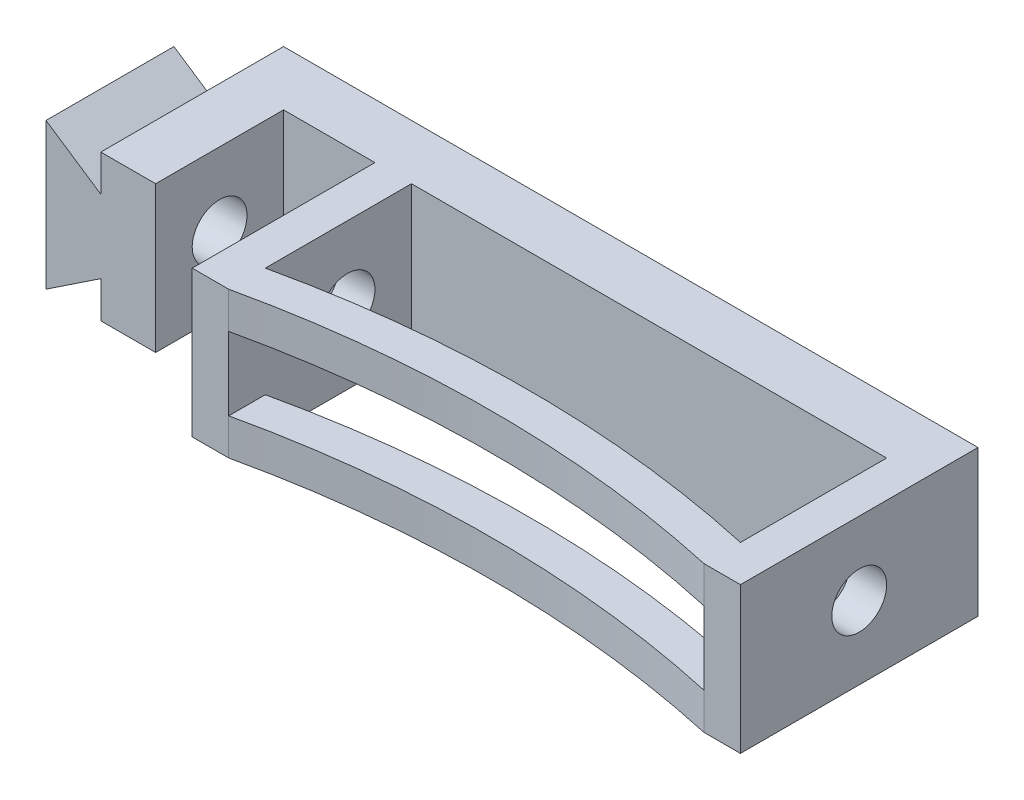
ISO-10303-21;
HEADER;
FILE_DESCRIPTION(('STEP AP214'),'2;1');
FILE_NAME('part.step','',(''),(''),'','','');
FILE_SCHEMA(('AUTOMOTIVE_DESIGN { 1 0 10303 214 1 1 1 1 }'));
ENDSEC;
DATA;
#1=APPLICATION_CONTEXT('core data for automotive mechanical design processes');
#2=APPLICATION_PROTOCOL_DEFINITION('international standard','automotive_design',2000,#1);
#3=PRODUCT_CONTEXT('',#1,'mechanical');
#4=PRODUCT('Part','Part','',(#3));
#5=PRODUCT_RELATED_PRODUCT_CATEGORY('part','',(#4));
#6=PRODUCT_DEFINITION_FORMATION('','',#4);
#7=PRODUCT_DEFINITION_CONTEXT('part definition',#1,'design');
#8=PRODUCT_DEFINITION('design','',#6,#7);
#9=PRODUCT_DEFINITION_SHAPE('','',#8);
#10=(LENGTH_UNIT() NAMED_UNIT(*) SI_UNIT(.MILLI.,.METRE.));
#11=(NAMED_UNIT(*) PLANE_ANGLE_UNIT() SI_UNIT($,.RADIAN.));
#12=(NAMED_UNIT(*) SI_UNIT($,.STERADIAN.) SOLID_ANGLE_UNIT());
#13=UNCERTAINTY_MEASURE_WITH_UNIT(LENGTH_MEASURE(1.E-05),#10,'distance_accuracy_value','');
#14=(GEOMETRIC_REPRESENTATION_CONTEXT(3) GLOBAL_UNCERTAINTY_ASSIGNED_CONTEXT((#13)) GLOBAL_UNIT_ASSIGNED_CONTEXT((#10,
#11,#12)) REPRESENTATION_CONTEXT('',''));
#15=CARTESIAN_POINT('',(0.,0.,0.));
#16=DIRECTION('',(0.,0.,1.));
#17=DIRECTION('',(1.,0.,0.));
#18=AXIS2_PLACEMENT_3D('',#15,#16,#17);
#19=CARTESIAN_POINT('',(23.,-2.,71.5747385824299));
#20=DIRECTION('',(0.,1.,0.));
#21=DIRECTION('',(0.,0.,1.));
#22=AXIS2_PLACEMENT_3D('',#19,#20,#21);
#23=CYLINDRICAL_SURFACE('',#22,60.);
#24=CARTESIAN_POINT('',(23.,0.,71.5747385824299));
#25=DIRECTION('',(0.,-1.,0.));
#26=DIRECTION('',(1.,0.,0.));
#27=AXIS2_PLACEMENT_3D('',#24,#25,#26);
#28=CIRCLE('',#27,60.);
#29=CARTESIAN_POINT('',(36.,0.,13.));
#30=VERTEX_POINT('',#29);
#31=CARTESIAN_POINT('',(10.,0.,13.));
#32=VERTEX_POINT('',#31);
#33=EDGE_CURVE('E209',#30,#32,#28,.F.);
#34=ORIENTED_EDGE('',*,*,#33,.T.);
#35=DIRECTION('',(0.,1.,0.));
#36=VECTOR('',#35,1.);
#37=CARTESIAN_POINT('',(10.,5.99999999999999,13.));
#38=LINE('',#37,#36);
#39=CARTESIAN_POINT('',(10.,-2.,13.));
#40=VERTEX_POINT('',#39);
#41=EDGE_CURVE('E217',#40,#32,#38,.T.);
#42=ORIENTED_EDGE('',*,*,#41,.F.);
#43=CARTESIAN_POINT('',(23.,-2.,71.5747385824299));
#44=DIRECTION('',(0.,-1.,0.));
#45=DIRECTION('',(0.,0.,-1.));
#46=AXIS2_PLACEMENT_3D('',#43,#44,#45);
#47=CIRCLE('',#46,60.);
#48=CARTESIAN_POINT('',(36.,-2.,13.));
#49=VERTEX_POINT('',#48);
#50=EDGE_CURVE('E368',#40,#49,#47,.T.);
#51=ORIENTED_EDGE('',*,*,#50,.T.);
#52=DIRECTION('',(0.,-1.,0.));
#53=VECTOR('',#52,1.);
#54=CARTESIAN_POINT('',(36.,5.99999999999999,13.));
#55=LINE('',#54,#53);
#56=EDGE_CURVE('E219',#30,#49,#55,.T.);
#57=ORIENTED_EDGE('',*,*,#56,.F.);
#58=EDGE_LOOP('',(#34,#42,#51,#57));
#59=FACE_BOUND('',#58,.T.);
#60=ADVANCED_FACE('F43',(#59),#23,.F.);
#61=CARTESIAN_POINT('',(23.,-2.,69.5747385824299));
#62=DIRECTION('',(0.,1.,0.));
#63=DIRECTION('',(0.,0.,1.));
#64=AXIS2_PLACEMENT_3D('',#61,#62,#63);
#65=CYLINDRICAL_SURFACE('',#64,60.);
#66=CARTESIAN_POINT('',(23.,0.,69.5747385824299));
#67=DIRECTION('',(0.,-1.,0.));
#68=DIRECTION('',(1.,0.,0.));
#69=AXIS2_PLACEMENT_3D('',#66,#67,#68);
#70=CIRCLE('',#69,60.);
#71=CARTESIAN_POINT('',(10.,0.,11.));
#72=VERTEX_POINT('',#71);
#73=CARTESIAN_POINT('',(36.,0.,11.));
#74=VERTEX_POINT('',#73);
#75=EDGE_CURVE('E212',#72,#74,#70,.T.);
#76=ORIENTED_EDGE('',*,*,#75,.T.);
#77=DIRECTION('',(0.,1.,0.));
#78=VECTOR('',#77,1.);
#79=CARTESIAN_POINT('',(36.,-2.,11.));
#80=LINE('',#79,#78);
#81=CARTESIAN_POINT('',(36.,-2.,11.));
#82=VERTEX_POINT('',#81);
#83=EDGE_CURVE('E416',#82,#74,#80,.T.);
#84=ORIENTED_EDGE('',*,*,#83,.F.);
#85=CARTESIAN_POINT('',(23.,-2.,69.5747385824299));
#86=DIRECTION('',(0.,1.,0.));
#87=DIRECTION('',(0.,0.,-1.));
#88=AXIS2_PLACEMENT_3D('',#85,#86,#87);
#89=CIRCLE('',#88,60.);
#90=CARTESIAN_POINT('',(10.,-2.,11.));
#91=VERTEX_POINT('',#90);
#92=EDGE_CURVE('E426',#82,#91,#89,.T.);
#93=ORIENTED_EDGE('',*,*,#92,.T.);
#94=DIRECTION('',(0.,1.,0.));
#95=VECTOR('',#94,1.);
#96=CARTESIAN_POINT('',(10.,-2.,11.));
#97=LINE('',#96,#95);
#98=EDGE_CURVE('E415',#91,#72,#97,.T.);
#99=ORIENTED_EDGE('',*,*,#98,.T.);
#100=EDGE_LOOP('',(#76,#84,#93,#99));
#101=FACE_BOUND('',#100,.T.);
#102=ADVANCED_FACE('F454',(#101),#65,.T.);
#103=CARTESIAN_POINT('',(0.,0.,3.));
#104=DIRECTION('',(0.,0.,1.));
#105=DIRECTION('',(1.,0.,0.));
#106=AXIS2_PLACEMENT_3D('',#103,#104,#105);
#107=PLANE('',#106);
#108=DIRECTION('',(-1.,0.,0.));
#109=VECTOR('',#108,1.);
#110=CARTESIAN_POINT('',(38.,-2.,3.));
#111=LINE('',#110,#109);
#112=CARTESIAN_POINT('',(36.,-2.,3.));
#113=VERTEX_POINT('',#112);
#114=CARTESIAN_POINT('',(10.,-2.,3.));
#115=VERTEX_POINT('',#114);
#116=EDGE_CURVE('E242',#113,#115,#111,.T.);
#117=ORIENTED_EDGE('',*,*,#116,.F.);
#118=DIRECTION('',(0.,-1.,0.));
#119=VECTOR('',#118,1.);
#120=CARTESIAN_POINT('',(36.,5.99999999999999,3.));
#121=LINE('',#120,#119);
#122=CARTESIAN_POINT('',(36.,5.99999999999999,3.));
#123=VERTEX_POINT('',#122);
#124=EDGE_CURVE('E340',#123,#113,#121,.T.);
#125=ORIENTED_EDGE('',*,*,#124,.F.);
#126=DIRECTION('',(1.,0.,0.));
#127=VECTOR('',#126,1.);
#128=CARTESIAN_POINT('',(38.,6.,3.));
#129=LINE('',#128,#127);
#130=CARTESIAN_POINT('',(10.,6.,3.));
#131=VERTEX_POINT('',#130);
#132=EDGE_CURVE('E254',#131,#123,#129,.T.);
#133=ORIENTED_EDGE('',*,*,#132,.F.);
#134=DIRECTION('',(0.,1.,0.));
#135=VECTOR('',#134,1.);
#136=CARTESIAN_POINT('',(10.,5.99999999999999,3.));
#137=LINE('',#136,#135);
#138=EDGE_CURVE('E236',#115,#131,#137,.T.);
#139=ORIENTED_EDGE('',*,*,#138,.F.);
#140=EDGE_LOOP('',(#117,#125,#133,#139));
#141=FACE_BOUND('',#140,.T.);
#142=ADVANCED_FACE('F461',(#141),#107,.T.);
#143=CARTESIAN_POINT('',(8.00000000000001,-2.,3.));
#144=VERTEX_POINT('',#143);
#145=CARTESIAN_POINT('',(3.,-2.,3.));
#146=VERTEX_POINT('',#145);
#147=EDGE_CURVE('E239',#144,#146,#111,.T.);
#148=ORIENTED_EDGE('',*,*,#147,.F.);
#149=DIRECTION('',(0.,-1.,0.));
#150=VECTOR('',#149,1.);
#151=CARTESIAN_POINT('',(8.,5.99999999999999,3.));
#152=LINE('',#151,#150);
#153=CARTESIAN_POINT('',(8.,5.99999999999999,3.));
#154=VERTEX_POINT('',#153);
#155=EDGE_CURVE('E342',#154,#144,#152,.T.);
#156=ORIENTED_EDGE('',*,*,#155,.F.);
#157=CARTESIAN_POINT('',(3.,5.99999999999999,3.));
#158=VERTEX_POINT('',#157);
#159=EDGE_CURVE('E250',#158,#154,#129,.T.);
#160=ORIENTED_EDGE('',*,*,#159,.F.);
#161=DIRECTION('',(0.,1.,0.));
#162=VECTOR('',#161,1.);
#163=CARTESIAN_POINT('',(3.,5.99999999999999,3.));
#164=LINE('',#163,#162);
#165=EDGE_CURVE('E237',#146,#158,#164,.T.);
#166=ORIENTED_EDGE('',*,*,#165,.F.);
#167=EDGE_LOOP('',(#148,#156,#160,#166));
#168=FACE_BOUND('',#167,.T.);
#169=ADVANCED_FACE('F366',(#168),#107,.T.);
#170=CARTESIAN_POINT('',(38.,0.,10.));
#171=DIRECTION('',(1.,0.,0.));
#172=DIRECTION('',(0.,0.,-1.));
#173=AXIS2_PLACEMENT_3D('',#170,#171,#172);
#174=PLANE('',#173);
#175=CARTESIAN_POINT('',(38.,1.99999999999999,6.5));
#176=DIRECTION('',(1.,0.,0.));
#177=DIRECTION('',(0.,1.,0.));
#178=AXIS2_PLACEMENT_3D('',#175,#176,#177);
#179=CIRCLE('',#178,1.5);
#180=CARTESIAN_POINT('',(38.,3.49999999999999,6.5));
#181=VERTEX_POINT('',#180);
#182=EDGE_CURVE('E409',#181,#181,#179,.T.);
#183=ORIENTED_EDGE('',*,*,#182,.F.);
#184=EDGE_LOOP('',(#183));
#185=FACE_BOUND('',#184,.T.);
#186=DIRECTION('',(0.,0.,-1.));
#187=VECTOR('',#186,1.);
#188=CARTESIAN_POINT('',(38.,6.,10.));
#189=LINE('',#188,#187);
#190=CARTESIAN_POINT('',(38.,6.,13.));
#191=VERTEX_POINT('',#190);
#192=CARTESIAN_POINT('',(38.,6.,0.));
#193=VERTEX_POINT('',#192);
#194=EDGE_CURVE('E304',#191,#193,#189,.T.);
#195=ORIENTED_EDGE('',*,*,#194,.F.);
#196=DIRECTION('',(0.,1.,0.));
#197=VECTOR('',#196,1.);
#198=CARTESIAN_POINT('',(38.,6.,13.));
#199=LINE('',#198,#197);
#200=CARTESIAN_POINT('',(38.,-2.,13.));
#201=VERTEX_POINT('',#200);
#202=EDGE_CURVE('E325',#201,#191,#199,.T.);
#203=ORIENTED_EDGE('',*,*,#202,.F.);
#204=DIRECTION('',(0.,0.,-1.));
#205=VECTOR('',#204,1.);
#206=CARTESIAN_POINT('',(38.,-2.,10.));
#207=LINE('',#206,#205);
#208=CARTESIAN_POINT('',(38.,-2.,0.));
#209=VERTEX_POINT('',#208);
#210=EDGE_CURVE('E306',#201,#209,#207,.T.);
#211=ORIENTED_EDGE('',*,*,#210,.T.);
#212=DIRECTION('',(0.,-1.,0.));
#213=VECTOR('',#212,1.);
#214=CARTESIAN_POINT('',(38.,0.,0.));
#215=LINE('',#214,#213);
#216=EDGE_CURVE('E289',#193,#209,#215,.T.);
#217=ORIENTED_EDGE('',*,*,#216,.F.);
#218=EDGE_LOOP('',(#195,#203,#211,#217));
#219=FACE_BOUND('',#218,.T.);
#220=ADVANCED_FACE('F321',(#185,#219),#174,.T.);
#221=CARTESIAN_POINT('',(0.,0.,10.));
#222=DIRECTION('',(-0.554700196225229,0.832050294337844,0.));
#223=DIRECTION('',(-0.832050294337844,-0.554700196225229,0.));
#224=AXIS2_PLACEMENT_3D('',#221,#222,#223);
#225=PLANE('',#224);
#226=DIRECTION('',(0.,0.,-1.));
#227=VECTOR('',#226,1.);
#228=CARTESIAN_POINT('',(-3.,-2.,10.));
#229=LINE('',#228,#227);
#230=CARTESIAN_POINT('',(-3.,-2.,10.));
#231=VERTEX_POINT('',#230);
#232=CARTESIAN_POINT('',(-3.,-2.,3.));
#233=VERTEX_POINT('',#232);
#234=EDGE_CURVE('E284',#231,#233,#229,.T.);
#235=ORIENTED_EDGE('',*,*,#234,.T.);
#236=DIRECTION('',(0.832050294337844,0.554700196225229,0.));
#237=VECTOR('',#236,1.);
#238=CARTESIAN_POINT('',(0.,0.,3.));
#239=LINE('',#238,#237);
#240=CARTESIAN_POINT('',(0.,0.,3.));
#241=VERTEX_POINT('',#240);
#242=EDGE_CURVE('E257',#233,#241,#239,.T.);
#243=ORIENTED_EDGE('',*,*,#242,.T.);
#244=DIRECTION('',(0.,0.,-1.));
#245=VECTOR('',#244,1.);
#246=CARTESIAN_POINT('',(0.,0.,10.));
#247=LINE('',#246,#245);
#248=CARTESIAN_POINT('',(0.,0.,10.));
#249=VERTEX_POINT('',#248);
#250=EDGE_CURVE('E12',#249,#241,#247,.T.);
#251=ORIENTED_EDGE('',*,*,#250,.F.);
#252=DIRECTION('',(0.832050294337844,0.554700196225229,0.));
#253=VECTOR('',#252,1.);
#254=CARTESIAN_POINT('',(0.,0.,10.));
#255=LINE('',#254,#253);
#256=EDGE_CURVE('E266',#231,#249,#255,.T.);
#257=ORIENTED_EDGE('',*,*,#256,.F.);
#258=EDGE_LOOP('',(#235,#243,#251,#257));
#259=FACE_BOUND('',#258,.T.);
#260=ADVANCED_FACE('F45',(#259),#225,.F.);
#261=CARTESIAN_POINT('',(0.,-2.,10.));
#262=DIRECTION('',(0.,1.,0.));
#263=DIRECTION('',(0.,0.,1.));
#264=AXIS2_PLACEMENT_3D('',#261,#262,#263);
#265=PLANE('',#264);
#266=DIRECTION('',(0.,0.,-1.));
#267=VECTOR('',#266,1.);
#268=CARTESIAN_POINT('',(10.,-2.,13.));
#269=LINE('',#268,#267);
#270=EDGE_CURVE('E347',#91,#115,#269,.T.);
#271=ORIENTED_EDGE('',*,*,#270,.F.);
#272=ORIENTED_EDGE('',*,*,#92,.F.);
#273=DIRECTION('',(0.,0.,-1.));
#274=VECTOR('',#273,1.);
#275=CARTESIAN_POINT('',(36.,-2.,13.));
#276=LINE('',#275,#274);
#277=EDGE_CURVE('E332',#82,#113,#276,.T.);
#278=ORIENTED_EDGE('',*,*,#277,.T.);
#279=ORIENTED_EDGE('',*,*,#116,.T.);
#280=EDGE_LOOP('',(#271,#272,#278,#279));
#281=FACE_BOUND('',#280,.T.);
#282=ORIENTED_EDGE('',*,*,#210,.F.);
#283=DIRECTION('',(1.,0.,0.));
#284=VECTOR('',#283,1.);
#285=CARTESIAN_POINT('',(38.,-2.,13.));
#286=LINE('',#285,#284);
#287=EDGE_CURVE('E328',#49,#201,#286,.T.);
#288=ORIENTED_EDGE('',*,*,#287,.F.);
#289=ORIENTED_EDGE('',*,*,#50,.F.);
#290=DIRECTION('',(1.,0.,0.));
#291=VECTOR('',#290,1.);
#292=CARTESIAN_POINT('',(8.00000000000001,-2.,13.));
#293=LINE('',#292,#291);
#294=CARTESIAN_POINT('',(8.00000000000001,-2.,13.));
#295=VERTEX_POINT('',#294);
#296=EDGE_CURVE('E226',#295,#40,#293,.T.);
#297=ORIENTED_EDGE('',*,*,#296,.F.);
#298=DIRECTION('',(0.,0.,-1.));
#299=VECTOR('',#298,1.);
#300=CARTESIAN_POINT('',(8.00000000000001,-2.,13.));
#301=LINE('',#300,#299);
#302=EDGE_CURVE('E345',#295,#144,#301,.T.);
#303=ORIENTED_EDGE('',*,*,#302,.T.);
#304=ORIENTED_EDGE('',*,*,#147,.T.);
#305=DIRECTION('',(0.,0.,1.));
#306=VECTOR('',#305,1.);
#307=CARTESIAN_POINT('',(3.,-2.,-35.9026461420325));
#308=LINE('',#307,#306);
#309=CARTESIAN_POINT('',(3.,-2.,10.));
#310=VERTEX_POINT('',#309);
#311=EDGE_CURVE('E240',#146,#310,#308,.T.);
#312=ORIENTED_EDGE('',*,*,#311,.T.);
#313=DIRECTION('',(1.,0.,0.));
#314=VECTOR('',#313,1.);
#315=CARTESIAN_POINT('',(0.,-2.,10.));
#316=LINE('',#315,#314);
#317=CARTESIAN_POINT('',(0.,-2.,10.));
#318=VERTEX_POINT('',#317);
#319=EDGE_CURVE('E272',#318,#310,#316,.T.);
#320=ORIENTED_EDGE('',*,*,#319,.F.);
#321=DIRECTION('',(0.,0.,-1.));
#322=VECTOR('',#321,1.);
#323=CARTESIAN_POINT('',(0.,-2.,10.));
#324=LINE('',#323,#322);
#325=CARTESIAN_POINT('',(0.,-2.,0.));
#326=VERTEX_POINT('',#325);
#327=EDGE_CURVE('E52',#318,#326,#324,.T.);
#328=ORIENTED_EDGE('',*,*,#327,.T.);
#329=DIRECTION('',(1.,0.,0.));
#330=VECTOR('',#329,1.);
#331=CARTESIAN_POINT('',(0.,-2.,0.));
#332=LINE('',#331,#330);
#333=EDGE_CURVE('E265',#326,#209,#332,.T.);
#334=ORIENTED_EDGE('',*,*,#333,.T.);
#335=EDGE_LOOP('',(#282,#288,#289,#297,#303,#304,#312,#320,#328,#334));
#336=FACE_BOUND('',#335,.T.);
#337=ADVANCED_FACE('F313',(#281,#336),#265,.F.);
#338=CARTESIAN_POINT('',(0.,6.,10.));
#339=DIRECTION('',(0.,1.,0.));
#340=DIRECTION('',(0.,0.,1.));
#341=AXIS2_PLACEMENT_3D('',#338,#339,#340);
#342=PLANE('',#341);
#343=CARTESIAN_POINT('',(23.,6.,69.5747385824299));
#344=DIRECTION('',(0.,1.,0.));
#345=DIRECTION('',(0.,0.,-1.));
#346=AXIS2_PLACEMENT_3D('',#343,#344,#345);
#347=CIRCLE('',#346,60.);
#348=CARTESIAN_POINT('',(36.,6.,11.));
#349=VERTEX_POINT('',#348);
#350=CARTESIAN_POINT('',(10.,6.,11.));
#351=VERTEX_POINT('',#350);
#352=EDGE_CURVE('E422',#349,#351,#347,.T.);
#353=ORIENTED_EDGE('',*,*,#352,.T.);
#354=DIRECTION('',(0.,0.,-1.));
#355=VECTOR('',#354,1.);
#356=CARTESIAN_POINT('',(10.,5.99999999999999,13.));
#357=LINE('',#356,#355);
#358=EDGE_CURVE('E350',#351,#131,#357,.T.);
#359=ORIENTED_EDGE('',*,*,#358,.T.);
#360=ORIENTED_EDGE('',*,*,#132,.T.);
#361=DIRECTION('',(0.,0.,-1.));
#362=VECTOR('',#361,1.);
#363=CARTESIAN_POINT('',(36.,5.99999999999999,13.));
#364=LINE('',#363,#362);
#365=EDGE_CURVE('E246',#349,#123,#364,.T.);
#366=ORIENTED_EDGE('',*,*,#365,.F.);
#367=EDGE_LOOP('',(#353,#359,#360,#366));
#368=FACE_BOUND('',#367,.T.);
#369=DIRECTION('',(0.,0.,1.));
#370=VECTOR('',#369,1.);
#371=CARTESIAN_POINT('',(3.,5.99999999999999,-35.9026461420325));
#372=LINE('',#371,#370);
#373=CARTESIAN_POINT('',(3.,6.,10.));
#374=VERTEX_POINT('',#373);
#375=EDGE_CURVE('E245',#158,#374,#372,.T.);
#376=ORIENTED_EDGE('',*,*,#375,.F.);
#377=ORIENTED_EDGE('',*,*,#159,.T.);
#378=DIRECTION('',(0.,0.,-1.));
#379=VECTOR('',#378,1.);
#380=CARTESIAN_POINT('',(8.,5.99999999999999,13.));
#381=LINE('',#380,#379);
#382=CARTESIAN_POINT('',(8.,5.99999999999999,13.));
#383=VERTEX_POINT('',#382);
#384=EDGE_CURVE('E352',#383,#154,#381,.T.);
#385=ORIENTED_EDGE('',*,*,#384,.F.);
#386=DIRECTION('',(-1.,0.,0.));
#387=VECTOR('',#386,1.);
#388=CARTESIAN_POINT('',(8.,5.99999999999999,13.));
#389=LINE('',#388,#387);
#390=CARTESIAN_POINT('',(10.,5.99999999999999,13.));
#391=VERTEX_POINT('',#390);
#392=EDGE_CURVE('E231',#391,#383,#389,.T.);
#393=ORIENTED_EDGE('',*,*,#392,.F.);
#394=CARTESIAN_POINT('',(23.,6.,71.5747385824299));
#395=DIRECTION('',(0.,-1.,0.));
#396=DIRECTION('',(0.,0.,-1.));
#397=AXIS2_PLACEMENT_3D('',#394,#395,#396);
#398=CIRCLE('',#397,60.);
#399=CARTESIAN_POINT('',(36.,6.,13.));
#400=VERTEX_POINT('',#399);
#401=EDGE_CURVE('E398',#391,#400,#398,.T.);
#402=ORIENTED_EDGE('',*,*,#401,.T.);
#403=DIRECTION('',(-1.,0.,0.));
#404=VECTOR('',#403,1.);
#405=CARTESIAN_POINT('',(38.,6.,13.));
#406=LINE('',#405,#404);
#407=EDGE_CURVE('E397',#191,#400,#406,.T.);
#408=ORIENTED_EDGE('',*,*,#407,.F.);
#409=ORIENTED_EDGE('',*,*,#194,.T.);
#410=DIRECTION('',(1.,0.,0.));
#411=VECTOR('',#410,1.);
#412=CARTESIAN_POINT('',(0.,6.,0.));
#413=LINE('',#412,#411);
#414=CARTESIAN_POINT('',(0.,6.,0.));
#415=VERTEX_POINT('',#414);
#416=EDGE_CURVE('E286',#415,#193,#413,.T.);
#417=ORIENTED_EDGE('',*,*,#416,.F.);
#418=DIRECTION('',(0.,0.,-1.));
#419=VECTOR('',#418,1.);
#420=CARTESIAN_POINT('',(0.,6.,10.));
#421=LINE('',#420,#419);
#422=CARTESIAN_POINT('',(0.,6.,10.));
#423=VERTEX_POINT('',#422);
#424=EDGE_CURVE('E302',#423,#415,#421,.T.);
#425=ORIENTED_EDGE('',*,*,#424,.F.);
#426=DIRECTION('',(1.,0.,0.));
#427=VECTOR('',#426,1.);
#428=CARTESIAN_POINT('',(0.,6.,10.));
#429=LINE('',#428,#427);
#430=EDGE_CURVE('E276',#423,#374,#429,.T.);
#431=ORIENTED_EDGE('',*,*,#430,.T.);
#432=EDGE_LOOP('',(#376,#377,#385,#393,#402,#408,#409,#417,#425,#431));
#433=FACE_BOUND('',#432,.T.);
#434=ADVANCED_FACE('F374',(#368,#433),#342,.T.);
#435=CARTESIAN_POINT('',(0.,0.,10.));
#436=DIRECTION('',(1.,0.,0.));
#437=DIRECTION('',(0.,0.,-1.));
#438=AXIS2_PLACEMENT_3D('',#435,#436,#437);
#439=PLANE('',#438);
#440=DIRECTION('',(0.,-1.,0.));
#441=VECTOR('',#440,1.);
#442=CARTESIAN_POINT('',(0.,0.,0.));
#443=LINE('',#442,#441);
#444=EDGE_CURVE('E270',#415,#326,#443,.T.);
#445=ORIENTED_EDGE('',*,*,#444,.T.);
#446=ORIENTED_EDGE('',*,*,#327,.F.);
#447=DIRECTION('',(0.,-1.,0.));
#448=VECTOR('',#447,1.);
#449=CARTESIAN_POINT('',(0.,0.,10.));
#450=LINE('',#449,#448);
#451=EDGE_CURVE('E269',#249,#318,#450,.T.);
#452=ORIENTED_EDGE('',*,*,#451,.F.);
#453=ORIENTED_EDGE('',*,*,#250,.T.);
#454=DIRECTION('',(0.,-1.,0.));
#455=VECTOR('',#454,1.);
#456=CARTESIAN_POINT('',(0.,0.,3.));
#457=LINE('',#456,#455);
#458=CARTESIAN_POINT('',(0.,4.,3.));
#459=VERTEX_POINT('',#458);
#460=EDGE_CURVE('E260',#459,#241,#457,.T.);
#461=ORIENTED_EDGE('',*,*,#460,.F.);
#462=DIRECTION('',(0.,0.,-1.));
#463=VECTOR('',#462,1.);
#464=CARTESIAN_POINT('',(0.,4.,10.));
#465=LINE('',#464,#463);
#466=CARTESIAN_POINT('',(0.,4.,10.));
#467=VERTEX_POINT('',#466);
#468=EDGE_CURVE('E299',#467,#459,#465,.T.);
#469=ORIENTED_EDGE('',*,*,#468,.F.);
#470=EDGE_CURVE('E273',#423,#467,#450,.T.);
#471=ORIENTED_EDGE('',*,*,#470,.F.);
#472=ORIENTED_EDGE('',*,*,#424,.T.);
#473=EDGE_LOOP('',(#445,#446,#452,#453,#461,#469,#471,#472));
#474=FACE_BOUND('',#473,.T.);
#475=ADVANCED_FACE('F383',(#474),#439,.F.);
#476=CARTESIAN_POINT('',(1.84615384615385,2.76923076923077,10.));
#477=DIRECTION('',(0.554700196225229,0.832050294337844,0.));
#478=DIRECTION('',(-0.832050294337844,0.554700196225229,0.));
#479=AXIS2_PLACEMENT_3D('',#476,#477,#478);
#480=PLANE('',#479);
#481=DIRECTION('',(0.832050294337844,-0.554700196225229,0.));
#482=VECTOR('',#481,1.);
#483=CARTESIAN_POINT('',(1.84615384615385,2.76923076923077,3.));
#484=LINE('',#483,#482);
#485=CARTESIAN_POINT('',(-3.,6.,3.));
#486=VERTEX_POINT('',#485);
#487=EDGE_CURVE('E262',#486,#459,#484,.T.);
#488=ORIENTED_EDGE('',*,*,#487,.F.);
#489=DIRECTION('',(0.,0.,-1.));
#490=VECTOR('',#489,1.);
#491=CARTESIAN_POINT('',(-3.,6.,10.));
#492=LINE('',#491,#490);
#493=CARTESIAN_POINT('',(-3.,6.,10.));
#494=VERTEX_POINT('',#493);
#495=EDGE_CURVE('E296',#494,#486,#492,.T.);
#496=ORIENTED_EDGE('',*,*,#495,.F.);
#497=DIRECTION('',(0.832050294337844,-0.554700196225229,0.));
#498=VECTOR('',#497,1.);
#499=CARTESIAN_POINT('',(1.84615384615385,2.76923076923077,10.));
#500=LINE('',#499,#498);
#501=EDGE_CURVE('E279',#494,#467,#500,.T.);
#502=ORIENTED_EDGE('',*,*,#501,.T.);
#503=ORIENTED_EDGE('',*,*,#468,.T.);
#504=EDGE_LOOP('',(#488,#496,#502,#503));
#505=FACE_BOUND('',#504,.T.);
#506=ADVANCED_FACE('F395',(#505),#480,.T.);
#507=CARTESIAN_POINT('',(-3.,0.,10.));
#508=DIRECTION('',(1.,0.,0.));
#509=DIRECTION('',(0.,1.,0.));
#510=AXIS2_PLACEMENT_3D('',#507,#508,#509);
#511=PLANE('',#510);
#512=ORIENTED_EDGE('',*,*,#495,.T.);
#513=DIRECTION('',(0.,-1.,0.));
#514=VECTOR('',#513,1.);
#515=CARTESIAN_POINT('',(-3.,0.,3.));
#516=LINE('',#515,#514);
#517=EDGE_CURVE('E253',#486,#233,#516,.T.);
#518=ORIENTED_EDGE('',*,*,#517,.T.);
#519=ORIENTED_EDGE('',*,*,#234,.F.);
#520=DIRECTION('',(0.,-1.,0.));
#521=VECTOR('',#520,1.);
#522=CARTESIAN_POINT('',(-3.,0.,10.));
#523=LINE('',#522,#521);
#524=EDGE_CURVE('E282',#494,#231,#523,.T.);
#525=ORIENTED_EDGE('',*,*,#524,.F.);
#526=EDGE_LOOP('',(#512,#518,#519,#525));
#527=FACE_BOUND('',#526,.T.);
#528=ADVANCED_FACE('F391',(#527),#511,.F.);
#529=CARTESIAN_POINT('',(0.,0.,10.));
#530=DIRECTION('',(0.,0.,1.));
#531=DIRECTION('',(1.,0.,0.));
#532=AXIS2_PLACEMENT_3D('',#529,#530,#531);
#533=PLANE('',#532);
#534=DIRECTION('',(0.,-1.,0.));
#535=VECTOR('',#534,1.);
#536=CARTESIAN_POINT('',(3.,5.99999999999999,10.));
#537=LINE('',#536,#535);
#538=EDGE_CURVE('E243',#374,#310,#537,.T.);
#539=ORIENTED_EDGE('',*,*,#538,.F.);
#540=ORIENTED_EDGE('',*,*,#430,.F.);
#541=ORIENTED_EDGE('',*,*,#470,.T.);
#542=ORIENTED_EDGE('',*,*,#501,.F.);
#543=ORIENTED_EDGE('',*,*,#524,.T.);
#544=ORIENTED_EDGE('',*,*,#256,.T.);
#545=ORIENTED_EDGE('',*,*,#451,.T.);
#546=ORIENTED_EDGE('',*,*,#319,.T.);
#547=EDGE_LOOP('',(#539,#540,#541,#542,#543,#544,#545,#546));
#548=FACE_BOUND('',#547,.T.);
#549=ADVANCED_FACE('F380',(#548),#533,.T.);
#550=CARTESIAN_POINT('',(0.,0.,0.));
#551=DIRECTION('',(0.,0.,1.));
#552=DIRECTION('',(1.,0.,0.));
#553=AXIS2_PLACEMENT_3D('',#550,#551,#552);
#554=PLANE('',#553);
#555=ORIENTED_EDGE('',*,*,#333,.F.);
#556=ORIENTED_EDGE('',*,*,#444,.F.);
#557=ORIENTED_EDGE('',*,*,#416,.T.);
#558=ORIENTED_EDGE('',*,*,#216,.T.);
#559=EDGE_LOOP('',(#555,#556,#557,#558));
#560=FACE_BOUND('',#559,.T.);
#561=ADVANCED_FACE('F317',(#560),#554,.F.);
#562=CARTESIAN_POINT('',(0.,0.,3.));
#563=DIRECTION('',(0.,0.,1.));
#564=DIRECTION('',(1.,0.,0.));
#565=AXIS2_PLACEMENT_3D('',#562,#563,#564);
#566=PLANE('',#565);
#567=ORIENTED_EDGE('',*,*,#517,.F.);
#568=ORIENTED_EDGE('',*,*,#487,.T.);
#569=ORIENTED_EDGE('',*,*,#460,.T.);
#570=ORIENTED_EDGE('',*,*,#242,.F.);
#571=EDGE_LOOP('',(#567,#568,#569,#570));
#572=FACE_BOUND('',#571,.T.);
#573=ADVANCED_FACE('F388',(#572),#566,.F.);
#574=CARTESIAN_POINT('',(3.,5.99999999999999,-35.9026461420325));
#575=DIRECTION('',(-1.,0.,0.));
#576=DIRECTION('',(0.,-1.,0.));
#577=AXIS2_PLACEMENT_3D('',#574,#575,#576);
#578=PLANE('',#577);
#579=CARTESIAN_POINT('',(3.,2.,6.5));
#580=DIRECTION('',(-1.,0.,0.));
#581=DIRECTION('',(0.,-1.,0.));
#582=AXIS2_PLACEMENT_3D('',#579,#580,#581);
#583=CIRCLE('',#582,1.5);
#584=CARTESIAN_POINT('',(3.,0.499999999999998,6.5));
#585=VERTEX_POINT('',#584);
#586=EDGE_CURVE('E348',#585,#585,#583,.F.);
#587=ORIENTED_EDGE('',*,*,#586,.F.);
#588=EDGE_LOOP('',(#587));
#589=FACE_BOUND('',#588,.T.);
#590=ORIENTED_EDGE('',*,*,#165,.T.);
#591=ORIENTED_EDGE('',*,*,#375,.T.);
#592=ORIENTED_EDGE('',*,*,#538,.T.);
#593=ORIENTED_EDGE('',*,*,#311,.F.);
#594=EDGE_LOOP('',(#590,#591,#592,#593));
#595=FACE_BOUND('',#594,.T.);
#596=ADVANCED_FACE('F378',(#589,#595),#578,.F.);
#597=CARTESIAN_POINT('',(8.,5.99999999999999,13.));
#598=DIRECTION('',(1.,0.,0.));
#599=DIRECTION('',(0.,1.,0.));
#600=AXIS2_PLACEMENT_3D('',#597,#598,#599);
#601=PLANE('',#600);
#602=CARTESIAN_POINT('',(8.,2.,6.5));
#603=DIRECTION('',(1.,0.,0.));
#604=DIRECTION('',(0.,1.,0.));
#605=AXIS2_PLACEMENT_3D('',#602,#603,#604);
#606=CIRCLE('',#605,1.5);
#607=CARTESIAN_POINT('',(8.,3.5,6.5));
#608=VERTEX_POINT('',#607);
#609=EDGE_CURVE('E403',#608,#608,#606,.F.);
#610=ORIENTED_EDGE('',*,*,#609,.F.);
#611=EDGE_LOOP('',(#610));
#612=FACE_BOUND('',#611,.T.);
#613=ORIENTED_EDGE('',*,*,#155,.T.);
#614=ORIENTED_EDGE('',*,*,#302,.F.);
#615=DIRECTION('',(0.,-1.,0.));
#616=VECTOR('',#615,1.);
#617=CARTESIAN_POINT('',(8.,5.99999999999999,13.));
#618=LINE('',#617,#616);
#619=EDGE_CURVE('E229',#383,#295,#618,.T.);
#620=ORIENTED_EDGE('',*,*,#619,.F.);
#621=ORIENTED_EDGE('',*,*,#384,.T.);
#622=EDGE_LOOP('',(#613,#614,#620,#621));
#623=FACE_BOUND('',#622,.T.);
#624=ADVANCED_FACE('F360',(#612,#623),#601,.F.);
#625=CARTESIAN_POINT('',(10.,5.99999999999999,13.));
#626=DIRECTION('',(-1.,0.,0.));
#627=DIRECTION('',(0.,-1.,0.));
#628=AXIS2_PLACEMENT_3D('',#625,#626,#627);
#629=PLANE('',#628);
#630=CARTESIAN_POINT('',(10.,2.,6.5));
#631=DIRECTION('',(-1.,0.,0.));
#632=DIRECTION('',(0.,-1.,0.));
#633=AXIS2_PLACEMENT_3D('',#630,#631,#632);
#634=CIRCLE('',#633,1.5);
#635=CARTESIAN_POINT('',(10.,0.499999999999996,6.5));
#636=VERTEX_POINT('',#635);
#637=EDGE_CURVE('E406',#636,#636,#634,.F.);
#638=ORIENTED_EDGE('',*,*,#637,.F.);
#639=EDGE_LOOP('',(#638));
#640=FACE_BOUND('',#639,.T.);
#641=ORIENTED_EDGE('',*,*,#358,.F.);
#642=CARTESIAN_POINT('',(10.,3.99999999999999,11.));
#643=VERTEX_POINT('',#642);
#644=EDGE_CURVE('E419',#643,#351,#97,.T.);
#645=ORIENTED_EDGE('',*,*,#644,.F.);
#646=DIRECTION('',(0.,0.,1.));
#647=VECTOR('',#646,1.);
#648=CARTESIAN_POINT('',(10.,4.,-0.000999999999999265));
#649=LINE('',#648,#647);
#650=CARTESIAN_POINT('',(10.,4.,13.));
#651=VERTEX_POINT('',#650);
#652=EDGE_CURVE('E64',#643,#651,#649,.T.);
#653=ORIENTED_EDGE('',*,*,#652,.T.);
#654=DIRECTION('',(0.,-1.,0.));
#655=VECTOR('',#654,1.);
#656=CARTESIAN_POINT('',(10.,4.,13.));
#657=LINE('',#656,#655);
#658=EDGE_CURVE('E192',#651,#32,#657,.T.);
#659=ORIENTED_EDGE('',*,*,#658,.T.);
#660=DIRECTION('',(0.,0.,1.));
#661=VECTOR('',#660,1.);
#662=CARTESIAN_POINT('',(10.,0.,-0.000999999999999265));
#663=LINE('',#662,#661);
#664=EDGE_CURVE('E197',#72,#32,#663,.T.);
#665=ORIENTED_EDGE('',*,*,#664,.F.);
#666=ORIENTED_EDGE('',*,*,#98,.F.);
#667=ORIENTED_EDGE('',*,*,#270,.T.);
#668=ORIENTED_EDGE('',*,*,#138,.T.);
#669=EDGE_LOOP('',(#641,#645,#653,#659,#665,#666,#667,#668));
#670=FACE_BOUND('',#669,.T.);
#671=ADVANCED_FACE('F195',(#640,#670),#629,.F.);
#672=CARTESIAN_POINT('',(0.,0.,13.));
#673=DIRECTION('',(0.,0.,1.));
#674=DIRECTION('',(1.,0.,0.));
#675=AXIS2_PLACEMENT_3D('',#672,#673,#674);
#676=PLANE('',#675);
#677=ORIENTED_EDGE('',*,*,#619,.T.);
#678=ORIENTED_EDGE('',*,*,#296,.T.);
#679=ORIENTED_EDGE('',*,*,#41,.T.);
#680=ORIENTED_EDGE('',*,*,#658,.F.);
#681=EDGE_CURVE('E227',#651,#391,#38,.T.);
#682=ORIENTED_EDGE('',*,*,#681,.T.);
#683=ORIENTED_EDGE('',*,*,#392,.T.);
#684=EDGE_LOOP('',(#677,#678,#679,#680,#682,#683));
#685=FACE_BOUND('',#684,.T.);
#686=ADVANCED_FACE('F225',(#685),#676,.T.);
#687=CARTESIAN_POINT('',(36.,5.99999999999999,13.));
#688=DIRECTION('',(1.,0.,0.));
#689=DIRECTION('',(0.,0.,-1.));
#690=AXIS2_PLACEMENT_3D('',#687,#688,#689);
#691=PLANE('',#690);
#692=CARTESIAN_POINT('',(36.,1.99999999999999,6.5));
#693=DIRECTION('',(1.,0.,0.));
#694=DIRECTION('',(0.,0.,-1.));
#695=AXIS2_PLACEMENT_3D('',#692,#693,#694);
#696=CIRCLE('',#695,1.5);
#697=CARTESIAN_POINT('',(36.,1.99999999999999,5.));
#698=VERTEX_POINT('',#697);
#699=EDGE_CURVE('E47',#698,#698,#696,.F.);
#700=ORIENTED_EDGE('',*,*,#699,.F.);
#701=EDGE_LOOP('',(#700));
#702=FACE_BOUND('',#701,.T.);
#703=ORIENTED_EDGE('',*,*,#277,.F.);
#704=ORIENTED_EDGE('',*,*,#83,.T.);
#705=DIRECTION('',(0.,0.,1.));
#706=VECTOR('',#705,1.);
#707=CARTESIAN_POINT('',(36.,0.,-0.000999999999999265));
#708=LINE('',#707,#706);
#709=EDGE_CURVE('E221',#74,#30,#708,.T.);
#710=ORIENTED_EDGE('',*,*,#709,.T.);
#711=DIRECTION('',(0.,1.,0.));
#712=VECTOR('',#711,1.);
#713=CARTESIAN_POINT('',(36.,4.,13.));
#714=LINE('',#713,#712);
#715=CARTESIAN_POINT('',(36.,3.99999999999999,13.));
#716=VERTEX_POINT('',#715);
#717=EDGE_CURVE('E203',#30,#716,#714,.T.);
#718=ORIENTED_EDGE('',*,*,#717,.T.);
#719=DIRECTION('',(0.,0.,1.));
#720=VECTOR('',#719,1.);
#721=CARTESIAN_POINT('',(36.,4.,-0.000999999999999265));
#722=LINE('',#721,#720);
#723=CARTESIAN_POINT('',(36.,4.,11.));
#724=VERTEX_POINT('',#723);
#725=EDGE_CURVE('E59',#724,#716,#722,.T.);
#726=ORIENTED_EDGE('',*,*,#725,.F.);
#727=EDGE_CURVE('E420',#724,#349,#80,.T.);
#728=ORIENTED_EDGE('',*,*,#727,.T.);
#729=ORIENTED_EDGE('',*,*,#365,.T.);
#730=ORIENTED_EDGE('',*,*,#124,.T.);
#731=EDGE_LOOP('',(#703,#704,#710,#718,#726,#728,#729,#730));
#732=FACE_BOUND('',#731,.T.);
#733=ADVANCED_FACE('F439',(#702,#732),#691,.F.);
#734=CARTESIAN_POINT('',(0.,0.,13.));
#735=DIRECTION('',(0.,0.,-1.));
#736=DIRECTION('',(-1.,0.,0.));
#737=AXIS2_PLACEMENT_3D('',#734,#735,#736);
#738=PLANE('',#737);
#739=ORIENTED_EDGE('',*,*,#202,.T.);
#740=ORIENTED_EDGE('',*,*,#407,.T.);
#741=EDGE_CURVE('E333',#400,#716,#55,.T.);
#742=ORIENTED_EDGE('',*,*,#741,.T.);
#743=ORIENTED_EDGE('',*,*,#717,.F.);
#744=ORIENTED_EDGE('',*,*,#56,.T.);
#745=ORIENTED_EDGE('',*,*,#287,.T.);
#746=EDGE_LOOP('',(#739,#740,#742,#743,#744,#745));
#747=FACE_BOUND('',#746,.T.);
#748=ADVANCED_FACE('F330',(#747),#738,.F.);
#749=CARTESIAN_POINT('',(38.,1.99999999999999,6.5));
#750=DIRECTION('',(-1.,0.,0.));
#751=DIRECTION('',(0.,-1.,0.));
#752=AXIS2_PLACEMENT_3D('',#749,#750,#751);
#753=CYLINDRICAL_SURFACE('',#752,1.5);
#754=ORIENTED_EDGE('',*,*,#182,.T.);
#755=EDGE_LOOP('',(#754));
#756=FACE_BOUND('',#755,.T.);
#757=ORIENTED_EDGE('',*,*,#699,.T.);
#758=EDGE_LOOP('',(#757));
#759=FACE_BOUND('',#758,.T.);
#760=ADVANCED_FACE('F479',(#756,#759),#753,.F.);
#761=ORIENTED_EDGE('',*,*,#637,.T.);
#762=EDGE_LOOP('',(#761));
#763=FACE_BOUND('',#762,.T.);
#764=ORIENTED_EDGE('',*,*,#609,.T.);
#765=EDGE_LOOP('',(#764));
#766=FACE_BOUND('',#765,.T.);
#767=ADVANCED_FACE('F476',(#763,#766),#753,.F.);
#768=CARTESIAN_POINT('',(0.,2.,6.5));
#769=DIRECTION('',(1.,0.,0.));
#770=DIRECTION('',(0.,1.,0.));
#771=AXIS2_PLACEMENT_3D('',#768,#769,#770);
#772=CIRCLE('',#771,1.5);
#773=CARTESIAN_POINT('',(0.,3.5,6.5));
#774=VERTEX_POINT('',#773);
#775=EDGE_CURVE('E412',#774,#774,#772,.T.);
#776=ORIENTED_EDGE('',*,*,#775,.F.);
#777=EDGE_LOOP('',(#776));
#778=FACE_BOUND('',#777,.T.);
#779=ORIENTED_EDGE('',*,*,#586,.T.);
#780=EDGE_LOOP('',(#779));
#781=FACE_BOUND('',#780,.T.);
#782=ADVANCED_FACE('F470',(#778,#781),#753,.F.);
#783=CARTESIAN_POINT('',(0.,2.,6.5));
#784=DIRECTION('',(1.,0.,0.));
#785=DIRECTION('',(0.,1.,0.));
#786=AXIS2_PLACEMENT_3D('',#783,#784,#785);
#787=PLANE('',#786);
#788=ORIENTED_EDGE('',*,*,#775,.T.);
#789=EDGE_LOOP('',(#788));
#790=FACE_BOUND('',#789,.T.);
#791=ADVANCED_FACE('F465',(#790),#787,.T.);
#792=CARTESIAN_POINT('',(23.,4.,71.5747385824299));
#793=DIRECTION('',(0.,1.,0.));
#794=DIRECTION('',(-1.,0.,0.));
#795=AXIS2_PLACEMENT_3D('',#792,#793,#794);
#796=CIRCLE('',#795,60.);
#797=EDGE_CURVE('E431',#651,#716,#796,.F.);
#798=ORIENTED_EDGE('',*,*,#797,.T.);
#799=ORIENTED_EDGE('',*,*,#741,.F.);
#800=ORIENTED_EDGE('',*,*,#401,.F.);
#801=ORIENTED_EDGE('',*,*,#681,.F.);
#802=EDGE_LOOP('',(#798,#799,#800,#801));
#803=FACE_BOUND('',#802,.T.);
#804=ADVANCED_FACE('F442',(#803),#23,.F.);
#805=CARTESIAN_POINT('',(23.,4.,69.5747385824299));
#806=DIRECTION('',(0.,1.,0.));
#807=DIRECTION('',(-1.,0.,0.));
#808=AXIS2_PLACEMENT_3D('',#805,#806,#807);
#809=CIRCLE('',#808,60.);
#810=EDGE_CURVE('E204',#724,#643,#809,.T.);
#811=ORIENTED_EDGE('',*,*,#810,.T.);
#812=ORIENTED_EDGE('',*,*,#644,.T.);
#813=ORIENTED_EDGE('',*,*,#352,.F.);
#814=ORIENTED_EDGE('',*,*,#727,.F.);
#815=EDGE_LOOP('',(#811,#812,#813,#814));
#816=FACE_BOUND('',#815,.T.);
#817=ADVANCED_FACE('F446',(#816),#65,.T.);
#818=CARTESIAN_POINT('',(10.,0.,-0.000999999999999265));
#819=DIRECTION('',(0.,-1.,0.));
#820=DIRECTION('',(1.,0.,0.));
#821=AXIS2_PLACEMENT_3D('',#818,#819,#820);
#822=PLANE('',#821);
#823=ORIENTED_EDGE('',*,*,#709,.F.);
#824=ORIENTED_EDGE('',*,*,#75,.F.);
#825=ORIENTED_EDGE('',*,*,#664,.T.);
#826=ORIENTED_EDGE('',*,*,#33,.F.);
#827=EDGE_LOOP('',(#823,#824,#825,#826));
#828=FACE_BOUND('',#827,.T.);
#829=ADVANCED_FACE('F208',(#828),#822,.F.);
#830=CARTESIAN_POINT('',(10.,4.,-0.000999999999999265));
#831=DIRECTION('',(0.,1.,0.));
#832=DIRECTION('',(-1.,0.,0.));
#833=AXIS2_PLACEMENT_3D('',#830,#831,#832);
#834=PLANE('',#833);
#835=ORIENTED_EDGE('',*,*,#652,.F.);
#836=ORIENTED_EDGE('',*,*,#810,.F.);
#837=ORIENTED_EDGE('',*,*,#725,.T.);
#838=ORIENTED_EDGE('',*,*,#797,.F.);
#839=EDGE_LOOP('',(#835,#836,#837,#838));
#840=FACE_BOUND('',#839,.T.);
#841=ADVANCED_FACE('F443',(#840),#834,.F.);
#842=CLOSED_SHELL('',(#60,#102,#142,#169,#220,#260,#337,#434,#475,#506,#528,#549,#561,#573,#596,
#624,#671,#686,#733,#748,#760,#767,#782,#791,#804,#817,#829,#841));
#843=MANIFOLD_SOLID_BREP('B2',#842);
#844=ADVANCED_BREP_SHAPE_REPRESENTATION('',(#18,#843),#14);
#845=SHAPE_DEFINITION_REPRESENTATION(#9,#844);
ENDSEC;
END-ISO-10303-21;
